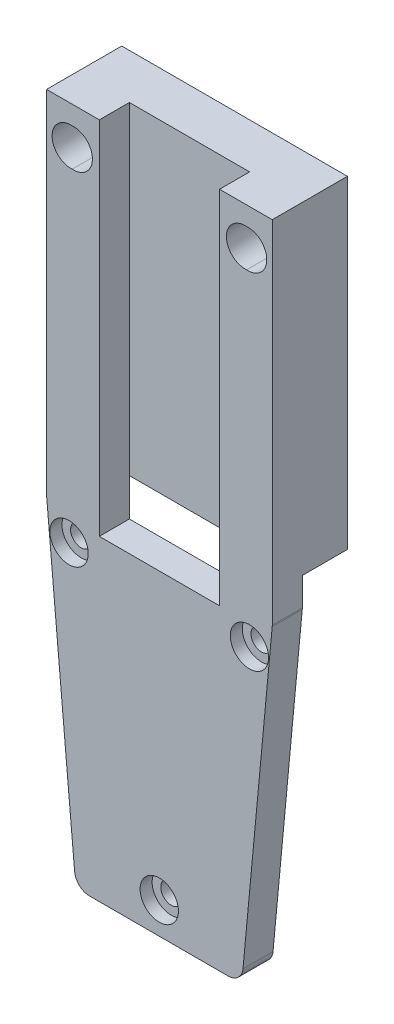
ISO-10303-21;
HEADER;
FILE_DESCRIPTION(('STEP AP214'),'2;1');
FILE_NAME('part.step','',(''),(''),'','','');
FILE_SCHEMA(('AUTOMOTIVE_DESIGN { 1 0 10303 214 1 1 1 1 }'));
ENDSEC;
DATA;
#1=APPLICATION_CONTEXT('core data for automotive mechanical design processes');
#2=APPLICATION_PROTOCOL_DEFINITION('international standard','automotive_design',2000,#1);
#3=PRODUCT_CONTEXT('',#1,'mechanical');
#4=PRODUCT('Part','Part','',(#3));
#5=PRODUCT_RELATED_PRODUCT_CATEGORY('part','',(#4));
#6=PRODUCT_DEFINITION_FORMATION('','',#4);
#7=PRODUCT_DEFINITION_CONTEXT('part definition',#1,'design');
#8=PRODUCT_DEFINITION('design','',#6,#7);
#9=PRODUCT_DEFINITION_SHAPE('','',#8);
#10=(LENGTH_UNIT() NAMED_UNIT(*) SI_UNIT(.MILLI.,.METRE.));
#11=(NAMED_UNIT(*) PLANE_ANGLE_UNIT() SI_UNIT($,.RADIAN.));
#12=(NAMED_UNIT(*) SI_UNIT($,.STERADIAN.) SOLID_ANGLE_UNIT());
#13=UNCERTAINTY_MEASURE_WITH_UNIT(LENGTH_MEASURE(1.E-05),#10,'distance_accuracy_value','');
#14=(GEOMETRIC_REPRESENTATION_CONTEXT(3) GLOBAL_UNCERTAINTY_ASSIGNED_CONTEXT((#13)) GLOBAL_UNIT_ASSIGNED_CONTEXT((#10,
#11,#12)) REPRESENTATION_CONTEXT('',''));
#15=CARTESIAN_POINT('',(0.,0.,0.));
#16=DIRECTION('',(0.,0.,1.));
#17=DIRECTION('',(1.,0.,0.));
#18=AXIS2_PLACEMENT_3D('',#15,#16,#17);
#19=CARTESIAN_POINT('',(0.,0.,2.));
#20=DIRECTION('',(0.,0.,-1.));
#21=DIRECTION('',(-1.,0.,0.));
#22=AXIS2_PLACEMENT_3D('',#19,#20,#21);
#23=CYLINDRICAL_SURFACE('',#22,0.700000000000001);
#24=CARTESIAN_POINT('',(0.,0.,0.));
#25=DIRECTION('',(0.,0.,1.));
#26=DIRECTION('',(1.,0.,0.));
#27=AXIS2_PLACEMENT_3D('',#24,#25,#26);
#28=CIRCLE('',#27,0.700000000000001);
#29=CARTESIAN_POINT('',(0.700000000000001,0.,0.));
#30=VERTEX_POINT('',#29);
#31=EDGE_CURVE('E338',#30,#30,#28,.T.);
#32=ORIENTED_EDGE('',*,*,#31,.F.);
#33=EDGE_LOOP('',(#32));
#34=FACE_BOUND('',#33,.T.);
#35=CARTESIAN_POINT('',(0.,0.,1.2));
#36=DIRECTION('',(0.,0.,1.));
#37=DIRECTION('',(1.,0.,0.));
#38=AXIS2_PLACEMENT_3D('',#35,#36,#37);
#39=CIRCLE('',#38,0.700000000000001);
#40=CARTESIAN_POINT('',(0.700000000000001,0.,1.2));
#41=VERTEX_POINT('',#40);
#42=EDGE_CURVE('E253',#41,#41,#39,.T.);
#43=ORIENTED_EDGE('',*,*,#42,.T.);
#44=EDGE_LOOP('',(#43));
#45=FACE_BOUND('',#44,.T.);
#46=ADVANCED_FACE('F49',(#34,#45),#23,.F.);
#47=CARTESIAN_POINT('',(6.0000000164,17.5961946972,2.));
#48=DIRECTION('',(0.,0.,-1.));
#49=DIRECTION('',(-1.,0.,0.));
#50=AXIS2_PLACEMENT_3D('',#47,#48,#49);
#51=CYLINDRICAL_SURFACE('',#50,0.699999999999999);
#52=CARTESIAN_POINT('',(6.0000000164,17.5961946972,0.));
#53=DIRECTION('',(0.,0.,1.));
#54=DIRECTION('',(1.,0.,0.));
#55=AXIS2_PLACEMENT_3D('',#52,#53,#54);
#56=CIRCLE('',#55,0.699999999999999);
#57=CARTESIAN_POINT('',(6.7000000164,17.5961946972,0.));
#58=VERTEX_POINT('',#57);
#59=EDGE_CURVE('E335',#58,#58,#56,.T.);
#60=ORIENTED_EDGE('',*,*,#59,.F.);
#61=EDGE_LOOP('',(#60));
#62=FACE_BOUND('',#61,.T.);
#63=CARTESIAN_POINT('',(6.0000000164,17.5961946972,1.2));
#64=DIRECTION('',(0.,0.,1.));
#65=DIRECTION('',(1.,0.,0.));
#66=AXIS2_PLACEMENT_3D('',#63,#64,#65);
#67=CIRCLE('',#66,0.699999999999999);
#68=CARTESIAN_POINT('',(6.7000000164,17.5961946972,1.2));
#69=VERTEX_POINT('',#68);
#70=EDGE_CURVE('E389',#69,#69,#67,.T.);
#71=ORIENTED_EDGE('',*,*,#70,.T.);
#72=EDGE_LOOP('',(#71));
#73=FACE_BOUND('',#72,.T.);
#74=ADVANCED_FACE('F480',(#62,#73),#51,.F.);
#75=CARTESIAN_POINT('',(-5.9999999917,17.5961946995,2.));
#76=DIRECTION('',(0.,0.,-1.));
#77=DIRECTION('',(-1.,0.,0.));
#78=AXIS2_PLACEMENT_3D('',#75,#76,#77);
#79=CYLINDRICAL_SURFACE('',#78,0.7);
#80=CARTESIAN_POINT('',(-5.9999999917,17.5961946995,0.));
#81=DIRECTION('',(0.,0.,1.));
#82=DIRECTION('',(1.,0.,0.));
#83=AXIS2_PLACEMENT_3D('',#80,#81,#82);
#84=CIRCLE('',#83,0.7);
#85=CARTESIAN_POINT('',(-5.2999999917,17.5961946995,0.));
#86=VERTEX_POINT('',#85);
#87=EDGE_CURVE('E326',#86,#86,#84,.T.);
#88=ORIENTED_EDGE('',*,*,#87,.F.);
#89=EDGE_LOOP('',(#88));
#90=FACE_BOUND('',#89,.T.);
#91=CARTESIAN_POINT('',(-5.9999999917,17.5961946995,1.2));
#92=DIRECTION('',(0.,0.,1.));
#93=DIRECTION('',(1.,0.,0.));
#94=AXIS2_PLACEMENT_3D('',#91,#92,#93);
#95=CIRCLE('',#94,0.7);
#96=CARTESIAN_POINT('',(-5.2999999917,17.5961946995,1.2));
#97=VERTEX_POINT('',#96);
#98=EDGE_CURVE('E237',#97,#97,#95,.T.);
#99=ORIENTED_EDGE('',*,*,#98,.T.);
#100=EDGE_LOOP('',(#99));
#101=FACE_BOUND('',#100,.T.);
#102=ADVANCED_FACE('F487',(#90,#101),#79,.F.);
#103=CARTESIAN_POINT('',(6.51847131240383,19.6020664223838,2.));
#104=DIRECTION('',(0.,0.,-1.));
#105=DIRECTION('',(-1.,0.,0.));
#106=AXIS2_PLACEMENT_3D('',#103,#104,#105);
#107=CYLINDRICAL_SURFACE('',#106,1.00000000001619);
#108=DIRECTION('',(0.,0.,-1.));
#109=VECTOR('',#108,1.);
#110=CARTESIAN_POINT('',(7.51847131242001,19.6020664224,0.));
#111=LINE('',#110,#109);
#112=CARTESIAN_POINT('',(7.51847131242001,19.6020664224,2.));
#113=VERTEX_POINT('',#112);
#114=CARTESIAN_POINT('',(7.51847131242001,19.6020664224,0.));
#115=VERTEX_POINT('',#114);
#116=EDGE_CURVE('E319',#113,#115,#111,.T.);
#117=ORIENTED_EDGE('',*,*,#116,.F.);
#118=CARTESIAN_POINT('',(6.51847131240383,19.6020664223838,2.));
#119=DIRECTION('',(0.,0.,1.));
#120=DIRECTION('',(1.,0.,0.));
#121=AXIS2_PLACEMENT_3D('',#118,#119,#120);
#122=CIRCLE('',#121,1.00000000001619);
#123=CARTESIAN_POINT('',(7.51408358778784,19.5084918684867,2.));
#124=VERTEX_POINT('',#123);
#125=EDGE_CURVE('E342',#124,#113,#122,.T.);
#126=ORIENTED_EDGE('',*,*,#125,.F.);
#127=DIRECTION('',(0.,0.,-1.));
#128=VECTOR('',#127,1.);
#129=CARTESIAN_POINT('',(7.51408358778784,19.5084918684867,2.));
#130=LINE('',#129,#128);
#131=CARTESIAN_POINT('',(7.51408358778784,19.5084918684867,0.));
#132=VERTEX_POINT('',#131);
#133=EDGE_CURVE('E358',#124,#132,#130,.T.);
#134=ORIENTED_EDGE('',*,*,#133,.T.);
#135=CARTESIAN_POINT('',(6.51847131240383,19.6020664223838,0.));
#136=DIRECTION('',(0.,0.,1.));
#137=DIRECTION('',(1.,0.,0.));
#138=AXIS2_PLACEMENT_3D('',#135,#136,#137);
#139=CIRCLE('',#138,1.00000000001619);
#140=EDGE_CURVE('E341',#132,#115,#139,.T.);
#141=ORIENTED_EDGE('',*,*,#140,.T.);
#142=EDGE_LOOP('',(#117,#126,#134,#141));
#143=FACE_BOUND('',#142,.T.);
#144=ADVANCED_FACE('F51',(#143),#107,.T.);
#145=CARTESIAN_POINT('',(-6.4963963842,19.6020664224,2.));
#146=DIRECTION('',(0.,0.,-1.));
#147=DIRECTION('',(-1.,0.,0.));
#148=AXIS2_PLACEMENT_3D('',#145,#146,#147);
#149=CYLINDRICAL_SURFACE('',#148,0.999999999999999);
#150=DIRECTION('',(0.,0.,1.));
#151=VECTOR('',#150,1.);
#152=CARTESIAN_POINT('',(-7.4963963842,19.6020664224,0.));
#153=LINE('',#152,#151);
#154=CARTESIAN_POINT('',(-7.4963963842,19.6020664224,0.));
#155=VERTEX_POINT('',#154);
#156=CARTESIAN_POINT('',(-7.4963963842,19.6020664224,2.));
#157=VERTEX_POINT('',#156);
#158=EDGE_CURVE('E316',#155,#157,#153,.T.);
#159=ORIENTED_EDGE('',*,*,#158,.F.);
#160=CARTESIAN_POINT('',(-6.4963963842,19.6020664224,0.));
#161=DIRECTION('',(0.,0.,1.));
#162=DIRECTION('',(1.,0.,0.));
#163=AXIS2_PLACEMENT_3D('',#160,#161,#162);
#164=CIRCLE('',#163,0.999999999999999);
#165=CARTESIAN_POINT('',(-7.4923720904787,19.5124428066359,0.));
#166=VERTEX_POINT('',#165);
#167=EDGE_CURVE('E360',#155,#166,#164,.T.);
#168=ORIENTED_EDGE('',*,*,#167,.T.);
#169=DIRECTION('',(0.,0.,-1.));
#170=VECTOR('',#169,1.);
#171=CARTESIAN_POINT('',(-7.4923720904787,19.5124428066359,2.));
#172=LINE('',#171,#170);
#173=CARTESIAN_POINT('',(-7.4923720904787,19.5124428066359,2.));
#174=VERTEX_POINT('',#173);
#175=EDGE_CURVE('E199',#174,#166,#172,.T.);
#176=ORIENTED_EDGE('',*,*,#175,.F.);
#177=CARTESIAN_POINT('',(-6.4963963842,19.6020664224,2.));
#178=DIRECTION('',(0.,0.,1.));
#179=DIRECTION('',(1.,0.,0.));
#180=AXIS2_PLACEMENT_3D('',#177,#178,#179);
#181=CIRCLE('',#180,0.999999999999999);
#182=EDGE_CURVE('E345',#157,#174,#181,.T.);
#183=ORIENTED_EDGE('',*,*,#182,.F.);
#184=EDGE_LOOP('',(#159,#168,#176,#183));
#185=FACE_BOUND('',#184,.T.);
#186=ADVANCED_FACE('F411',(#185),#149,.T.);
#187=CARTESIAN_POINT('',(6.51847131240383,19.6020664223838,2.));
#188=DIRECTION('',(0.,0.,1.));
#189=DIRECTION('',(1.,0.,0.));
#190=AXIS2_PLACEMENT_3D('',#187,#188,#189);
#191=PLANE('',#190);
#192=CARTESIAN_POINT('',(-5.69639638419982,40.4680094846855,2.));
#193=DIRECTION('',(0.,0.,1.));
#194=DIRECTION('',(1.,0.,0.));
#195=AXIS2_PLACEMENT_3D('',#192,#193,#194);
#196=CIRCLE('',#195,1.24999999999906);
#197=CARTESIAN_POINT('',(-5.78896253588998,39.22144159341,2.));
#198=VERTEX_POINT('',#197);
#199=CARTESIAN_POINT('',(-5.78896253588998,41.7145773759609,2.));
#200=VERTEX_POINT('',#199);
#201=EDGE_CURVE('E64',#198,#200,#196,.T.);
#202=ORIENTED_EDGE('',*,*,#201,.F.);
#203=CARTESIAN_POINT('',(-5.88152868758014,40.4680094846855,2.));
#204=DIRECTION('',(0.,0.,-1.));
#205=DIRECTION('',(-1.,0.,0.));
#206=AXIS2_PLACEMENT_3D('',#203,#204,#205);
#207=CIRCLE('',#206,1.24999999999906);
#208=EDGE_CURVE('E224',#198,#200,#207,.T.);
#209=ORIENTED_EDGE('',*,*,#208,.T.);
#210=EDGE_LOOP('',(#202,#209));
#211=FACE_BOUND('',#210,.T.);
#212=CARTESIAN_POINT('',(5.90360361580018,40.4680094846855,2.));
#213=DIRECTION('',(0.,0.,1.));
#214=DIRECTION('',(1.,0.,0.));
#215=AXIS2_PLACEMENT_3D('',#212,#213,#214);
#216=CIRCLE('',#215,1.24999999999906);
#217=CARTESIAN_POINT('',(5.81103746411002,39.22144159341,2.));
#218=VERTEX_POINT('',#217);
#219=CARTESIAN_POINT('',(5.81103746411002,41.7145773759609,2.));
#220=VERTEX_POINT('',#219);
#221=EDGE_CURVE('E72',#218,#220,#216,.T.);
#222=ORIENTED_EDGE('',*,*,#221,.F.);
#223=CARTESIAN_POINT('',(5.71847131241986,40.4680094846855,2.));
#224=DIRECTION('',(0.,0.,-1.));
#225=DIRECTION('',(-1.,0.,0.));
#226=AXIS2_PLACEMENT_3D('',#223,#224,#225);
#227=CIRCLE('',#226,1.24999999999906);
#228=EDGE_CURVE('E216',#218,#220,#227,.T.);
#229=ORIENTED_EDGE('',*,*,#228,.T.);
#230=EDGE_LOOP('',(#222,#229));
#231=FACE_BOUND('',#230,.T.);
#232=CARTESIAN_POINT('',(-5.9999999917,17.5961946995,2.));
#233=DIRECTION('',(0.,0.,1.));
#234=DIRECTION('',(1.,0.,0.));
#235=AXIS2_PLACEMENT_3D('',#232,#233,#234);
#236=CIRCLE('',#235,1.275);
#237=CARTESIAN_POINT('',(-4.7249999917,17.5961946995,2.));
#238=VERTEX_POINT('',#237);
#239=EDGE_CURVE('E238',#238,#238,#236,.T.);
#240=ORIENTED_EDGE('',*,*,#239,.F.);
#241=EDGE_LOOP('',(#240));
#242=FACE_BOUND('',#241,.T.);
#243=CARTESIAN_POINT('',(6.0000000164,17.5961946972,2.));
#244=DIRECTION('',(0.,0.,1.));
#245=DIRECTION('',(1.,0.,0.));
#246=AXIS2_PLACEMENT_3D('',#243,#244,#245);
#247=CIRCLE('',#246,1.275);
#248=CARTESIAN_POINT('',(7.2750000164,17.5961946972,2.));
#249=VERTEX_POINT('',#248);
#250=EDGE_CURVE('E241',#249,#249,#247,.T.);
#251=ORIENTED_EDGE('',*,*,#250,.F.);
#252=EDGE_LOOP('',(#251));
#253=FACE_BOUND('',#252,.T.);
#254=CARTESIAN_POINT('',(0.,0.,2.));
#255=DIRECTION('',(0.,0.,1.));
#256=DIRECTION('',(1.,0.,0.));
#257=AXIS2_PLACEMENT_3D('',#254,#255,#256);
#258=CIRCLE('',#257,1.275);
#259=CARTESIAN_POINT('',(1.275,0.,2.));
#260=VERTEX_POINT('',#259);
#261=EDGE_CURVE('E213',#260,#260,#258,.T.);
#262=ORIENTED_EDGE('',*,*,#261,.F.);
#263=EDGE_LOOP('',(#262));
#264=FACE_BOUND('',#263,.T.);
#265=DIRECTION('',(0.,1.,0.));
#266=VECTOR('',#265,1.);
#267=CARTESIAN_POINT('',(7.51847131242001,19.6020664224,2.));
#268=LINE('',#267,#266);
#269=CARTESIAN_POINT('',(7.51847131242001,42.9620664224,2.));
#270=VERTEX_POINT('',#269);
#271=EDGE_CURVE('E330',#113,#270,#268,.T.);
#272=ORIENTED_EDGE('',*,*,#271,.T.);
#273=DIRECTION('',(1.,0.,0.));
#274=VECTOR('',#273,1.);
#275=CARTESIAN_POINT('',(0.,42.9620664224,2.));
#276=LINE('',#275,#274);
#277=CARTESIAN_POINT('',(4.01103746411,42.9620664224,2.));
#278=VERTEX_POINT('',#277);
#279=EDGE_CURVE('E256',#278,#270,#276,.T.);
#280=ORIENTED_EDGE('',*,*,#279,.F.);
#281=DIRECTION('',(0.,-1.,0.));
#282=VECTOR('',#281,1.);
#283=CARTESIAN_POINT('',(4.01103746411001,23.9620664224,2.));
#284=LINE('',#283,#282);
#285=CARTESIAN_POINT('',(4.01103746411001,18.9620664224,2.));
#286=VERTEX_POINT('',#285);
#287=EDGE_CURVE('E296',#278,#286,#284,.T.);
#288=ORIENTED_EDGE('',*,*,#287,.T.);
#289=DIRECTION('',(-1.,0.,0.));
#290=VECTOR('',#289,1.);
#291=CARTESIAN_POINT('',(4.01103746411001,18.9620664224,2.));
#292=LINE('',#291,#290);
#293=CARTESIAN_POINT('',(-3.98896253588999,18.9620664224,2.));
#294=VERTEX_POINT('',#293);
#295=EDGE_CURVE('E299',#286,#294,#292,.T.);
#296=ORIENTED_EDGE('',*,*,#295,.T.);
#297=DIRECTION('',(0.,1.,0.));
#298=VECTOR('',#297,1.);
#299=CARTESIAN_POINT('',(-3.98896253588999,23.9620664224,2.));
#300=LINE('',#299,#298);
#301=CARTESIAN_POINT('',(-3.98896253588999,42.9620664224,2.));
#302=VERTEX_POINT('',#301);
#303=EDGE_CURVE('E294',#294,#302,#300,.T.);
#304=ORIENTED_EDGE('',*,*,#303,.T.);
#305=DIRECTION('',(1.,0.,0.));
#306=VECTOR('',#305,1.);
#307=CARTESIAN_POINT('',(0.,42.9620664224,2.));
#308=LINE('',#307,#306);
#309=CARTESIAN_POINT('',(-7.4963963842,42.9620664224,2.));
#310=VERTEX_POINT('',#309);
#311=EDGE_CURVE('E268',#310,#302,#308,.T.);
#312=ORIENTED_EDGE('',*,*,#311,.F.);
#313=DIRECTION('',(0.,1.,0.));
#314=VECTOR('',#313,1.);
#315=CARTESIAN_POINT('',(-7.4963963842,19.6020664224,2.));
#316=LINE('',#315,#314);
#317=EDGE_CURVE('E322',#157,#310,#316,.T.);
#318=ORIENTED_EDGE('',*,*,#317,.F.);
#319=ORIENTED_EDGE('',*,*,#182,.T.);
#320=DIRECTION('',(0.0896236157641481,-0.995975706278702,0.));
#321=VECTOR('',#320,1.);
#322=CARTESIAN_POINT('',(-7.49237209047871,19.5124428066359,2.));
#323=LINE('',#322,#321);
#324=CARTESIAN_POINT('',(-5.6307454508,-1.1755744249,2.));
#325=VERTEX_POINT('',#324);
#326=EDGE_CURVE('E348',#174,#325,#323,.T.);
#327=ORIENTED_EDGE('',*,*,#326,.T.);
#328=CARTESIAN_POINT('',(-4.63476974451216,-1.08595080910109,2.));
#329=DIRECTION('',(0.,0.,1.));
#330=DIRECTION('',(1.,0.,0.));
#331=AXIS2_PLACEMENT_3D('',#328,#329,#330);
#332=CIRCLE('',#331,1.00000000001221);
#333=CARTESIAN_POINT('',(-4.63476974452962,-2.0859508091133,2.));
#334=VERTEX_POINT('',#333);
#335=EDGE_CURVE('E350',#325,#334,#332,.T.);
#336=ORIENTED_EDGE('',*,*,#335,.T.);
#337=DIRECTION('',(1.,0.,0.));
#338=VECTOR('',#337,1.);
#339=CARTESIAN_POINT('',(-4.63476974452962,-2.08595080911331,2.));
#340=LINE('',#339,#338);
#341=CARTESIAN_POINT('',(4.57406782178784,-2.08595080911331,2.));
#342=VERTEX_POINT('',#341);
#343=EDGE_CURVE('E352',#334,#342,#340,.T.);
#344=ORIENTED_EDGE('',*,*,#343,.T.);
#345=CARTESIAN_POINT('',(4.57406782178784,-1.08595080911331,2.));
#346=DIRECTION('',(0.,0.,1.));
#347=DIRECTION('',(1.,0.,0.));
#348=AXIS2_PLACEMENT_3D('',#345,#346,#347);
#349=CIRCLE('',#348,1.);
#350=CARTESIAN_POINT('',(5.5696800971553,-1.17952536301354,2.));
#351=VERTEX_POINT('',#350);
#352=EDGE_CURVE('E354',#342,#351,#349,.T.);
#353=ORIENTED_EDGE('',*,*,#352,.T.);
#354=DIRECTION('',(0.0935745539013411,0.995612275367356,0.));
#355=VECTOR('',#354,1.);
#356=CARTESIAN_POINT('',(5.5696800971553,-1.17952536301354,2.));
#357=LINE('',#356,#355);
#358=EDGE_CURVE('E356',#351,#124,#357,.T.);
#359=ORIENTED_EDGE('',*,*,#358,.T.);
#360=ORIENTED_EDGE('',*,*,#125,.T.);
#361=EDGE_LOOP('',(#272,#280,#288,#296,#304,#312,#318,#319,#327,#336,#344,#353,#359,#360));
#362=FACE_BOUND('',#361,.T.);
#363=ADVANCED_FACE('F228',(#211,#231,#242,#253,#264,#362),#191,.T.);
#364=CARTESIAN_POINT('',(6.51847131240383,19.6020664223838,0.));
#365=DIRECTION('',(0.,0.,1.));
#366=DIRECTION('',(1.,0.,0.));
#367=AXIS2_PLACEMENT_3D('',#364,#365,#366);
#368=PLANE('',#367);
#369=DIRECTION('',(-1.,0.,0.));
#370=VECTOR('',#369,1.);
#371=CARTESIAN_POINT('',(-7.4963963842,21.4620664224,0.));
#372=LINE('',#371,#370);
#373=CARTESIAN_POINT('',(-3.98896253588999,21.4620664224,0.));
#374=VERTEX_POINT('',#373);
#375=CARTESIAN_POINT('',(-7.4963963842,21.4620664224,0.));
#376=VERTEX_POINT('',#375);
#377=EDGE_CURVE('E310',#374,#376,#372,.T.);
#378=ORIENTED_EDGE('',*,*,#377,.F.);
#379=DIRECTION('',(0.,1.,0.));
#380=VECTOR('',#379,1.);
#381=CARTESIAN_POINT('',(-3.98896253588999,23.9620664224,0.));
#382=LINE('',#381,#380);
#383=CARTESIAN_POINT('',(-3.98896253588999,18.9620664224,0.));
#384=VERTEX_POINT('',#383);
#385=EDGE_CURVE('E291',#384,#374,#382,.T.);
#386=ORIENTED_EDGE('',*,*,#385,.F.);
#387=DIRECTION('',(-1.,0.,0.));
#388=VECTOR('',#387,1.);
#389=CARTESIAN_POINT('',(4.01103746411001,18.9620664224,0.));
#390=LINE('',#389,#388);
#391=CARTESIAN_POINT('',(4.01103746411001,18.9620664224,0.));
#392=VERTEX_POINT('',#391);
#393=EDGE_CURVE('E297',#392,#384,#390,.T.);
#394=ORIENTED_EDGE('',*,*,#393,.F.);
#395=DIRECTION('',(0.,-1.,0.));
#396=VECTOR('',#395,1.);
#397=CARTESIAN_POINT('',(4.01103746411001,23.9620664224,0.));
#398=LINE('',#397,#396);
#399=CARTESIAN_POINT('',(4.01103746411001,21.4620664224,0.));
#400=VERTEX_POINT('',#399);
#401=EDGE_CURVE('E304',#400,#392,#398,.T.);
#402=ORIENTED_EDGE('',*,*,#401,.F.);
#403=CARTESIAN_POINT('',(7.51847131242001,21.4620664224,0.));
#404=VERTEX_POINT('',#403);
#405=EDGE_CURVE('E313',#404,#400,#372,.T.);
#406=ORIENTED_EDGE('',*,*,#405,.F.);
#407=DIRECTION('',(0.,1.,0.));
#408=VECTOR('',#407,1.);
#409=CARTESIAN_POINT('',(7.51847131242001,19.6020664224,0.));
#410=LINE('',#409,#408);
#411=EDGE_CURVE('E327',#115,#404,#410,.T.);
#412=ORIENTED_EDGE('',*,*,#411,.F.);
#413=ORIENTED_EDGE('',*,*,#140,.F.);
#414=DIRECTION('',(0.0935745539013411,0.995612275367356,0.));
#415=VECTOR('',#414,1.);
#416=CARTESIAN_POINT('',(5.5696800971553,-1.17952536301354,0.));
#417=LINE('',#416,#415);
#418=CARTESIAN_POINT('',(5.5696800971553,-1.17952536301354,0.));
#419=VERTEX_POINT('',#418);
#420=EDGE_CURVE('E346',#419,#132,#417,.T.);
#421=ORIENTED_EDGE('',*,*,#420,.F.);
#422=CARTESIAN_POINT('',(4.57406782178784,-1.08595080911331,0.));
#423=DIRECTION('',(0.,0.,1.));
#424=DIRECTION('',(1.,0.,0.));
#425=AXIS2_PLACEMENT_3D('',#422,#423,#424);
#426=CIRCLE('',#425,1.);
#427=CARTESIAN_POINT('',(4.57406782178784,-2.08595080911331,0.));
#428=VERTEX_POINT('',#427);
#429=EDGE_CURVE('E368',#428,#419,#426,.T.);
#430=ORIENTED_EDGE('',*,*,#429,.F.);
#431=DIRECTION('',(1.,0.,0.));
#432=VECTOR('',#431,1.);
#433=CARTESIAN_POINT('',(-4.63476974452962,-2.08595080911331,0.));
#434=LINE('',#433,#432);
#435=CARTESIAN_POINT('',(-4.63476974452962,-2.0859508091133,0.));
#436=VERTEX_POINT('',#435);
#437=EDGE_CURVE('E366',#436,#428,#434,.T.);
#438=ORIENTED_EDGE('',*,*,#437,.F.);
#439=CARTESIAN_POINT('',(-4.63476974451216,-1.08595080910109,0.));
#440=DIRECTION('',(0.,0.,1.));
#441=DIRECTION('',(1.,0.,0.));
#442=AXIS2_PLACEMENT_3D('',#439,#440,#441);
#443=CIRCLE('',#442,1.00000000001221);
#444=CARTESIAN_POINT('',(-5.6307454508,-1.1755744249,0.));
#445=VERTEX_POINT('',#444);
#446=EDGE_CURVE('E364',#445,#436,#443,.T.);
#447=ORIENTED_EDGE('',*,*,#446,.F.);
#448=DIRECTION('',(0.0896236157641481,-0.995975706278702,0.));
#449=VECTOR('',#448,1.);
#450=CARTESIAN_POINT('',(-7.49237209047871,19.5124428066359,0.));
#451=LINE('',#450,#449);
#452=EDGE_CURVE('E362',#166,#445,#451,.T.);
#453=ORIENTED_EDGE('',*,*,#452,.F.);
#454=ORIENTED_EDGE('',*,*,#167,.F.);
#455=DIRECTION('',(0.,1.,0.));
#456=VECTOR('',#455,1.);
#457=CARTESIAN_POINT('',(-7.4963963842,19.6020664224,0.));
#458=LINE('',#457,#456);
#459=EDGE_CURVE('E323',#155,#376,#458,.T.);
#460=ORIENTED_EDGE('',*,*,#459,.T.);
#461=EDGE_LOOP('',(#378,#386,#394,#402,#406,#412,#413,#421,#430,#438,#447,#453,#454,#460));
#462=FACE_BOUND('',#461,.T.);
#463=ORIENTED_EDGE('',*,*,#87,.T.);
#464=EDGE_LOOP('',(#463));
#465=FACE_BOUND('',#464,.T.);
#466=ORIENTED_EDGE('',*,*,#59,.T.);
#467=EDGE_LOOP('',(#466));
#468=FACE_BOUND('',#467,.T.);
#469=ORIENTED_EDGE('',*,*,#31,.T.);
#470=EDGE_LOOP('',(#469));
#471=FACE_BOUND('',#470,.T.);
#472=ADVANCED_FACE('F410',(#462,#465,#468,#471),#368,.F.);
#473=CARTESIAN_POINT('',(-7.49237209047871,19.5124428066359,2.));
#474=DIRECTION('',(0.995975706278702,0.0896236157641481,0.));
#475=DIRECTION('',(-0.0896236157641481,0.995975706278703,0.));
#476=AXIS2_PLACEMENT_3D('',#473,#474,#475);
#477=PLANE('',#476);
#478=ORIENTED_EDGE('',*,*,#452,.T.);
#479=DIRECTION('',(0.,0.,-1.));
#480=VECTOR('',#479,1.);
#481=CARTESIAN_POINT('',(-5.6307454508,-1.1755744249,2.));
#482=LINE('',#481,#480);
#483=EDGE_CURVE('E382',#325,#445,#482,.T.);
#484=ORIENTED_EDGE('',*,*,#483,.F.);
#485=ORIENTED_EDGE('',*,*,#326,.F.);
#486=ORIENTED_EDGE('',*,*,#175,.T.);
#487=EDGE_LOOP('',(#478,#484,#485,#486));
#488=FACE_BOUND('',#487,.T.);
#489=ADVANCED_FACE('F443',(#488),#477,.F.);
#490=CARTESIAN_POINT('',(-4.63476974451216,-1.08595080910109,2.));
#491=DIRECTION('',(0.,0.,-1.));
#492=DIRECTION('',(-1.,0.,0.));
#493=AXIS2_PLACEMENT_3D('',#490,#491,#492);
#494=CYLINDRICAL_SURFACE('',#493,1.00000000001221);
#495=ORIENTED_EDGE('',*,*,#446,.T.);
#496=DIRECTION('',(0.,0.,-1.));
#497=VECTOR('',#496,1.);
#498=CARTESIAN_POINT('',(-4.63476974452962,-2.0859508091133,2.));
#499=LINE('',#498,#497);
#500=EDGE_CURVE('E379',#334,#436,#499,.T.);
#501=ORIENTED_EDGE('',*,*,#500,.F.);
#502=ORIENTED_EDGE('',*,*,#335,.F.);
#503=ORIENTED_EDGE('',*,*,#483,.T.);
#504=EDGE_LOOP('',(#495,#501,#502,#503));
#505=FACE_BOUND('',#504,.T.);
#506=ADVANCED_FACE('F505',(#505),#494,.T.);
#507=CARTESIAN_POINT('',(-4.63476974452962,-2.08595080911331,2.));
#508=DIRECTION('',(0.,1.,0.));
#509=DIRECTION('',(0.,0.,1.));
#510=AXIS2_PLACEMENT_3D('',#507,#508,#509);
#511=PLANE('',#510);
#512=ORIENTED_EDGE('',*,*,#437,.T.);
#513=DIRECTION('',(0.,0.,-1.));
#514=VECTOR('',#513,1.);
#515=CARTESIAN_POINT('',(4.57406782178784,-2.08595080911331,2.));
#516=LINE('',#515,#514);
#517=EDGE_CURVE('E376',#342,#428,#516,.T.);
#518=ORIENTED_EDGE('',*,*,#517,.F.);
#519=ORIENTED_EDGE('',*,*,#343,.F.);
#520=ORIENTED_EDGE('',*,*,#500,.T.);
#521=EDGE_LOOP('',(#512,#518,#519,#520));
#522=FACE_BOUND('',#521,.T.);
#523=ADVANCED_FACE('F501',(#522),#511,.F.);
#524=CARTESIAN_POINT('',(4.57406782178784,-1.08595080911331,2.));
#525=DIRECTION('',(0.,0.,-1.));
#526=DIRECTION('',(-1.,0.,0.));
#527=AXIS2_PLACEMENT_3D('',#524,#525,#526);
#528=CYLINDRICAL_SURFACE('',#527,1.);
#529=ORIENTED_EDGE('',*,*,#429,.T.);
#530=DIRECTION('',(0.,0.,-1.));
#531=VECTOR('',#530,1.);
#532=CARTESIAN_POINT('',(5.5696800971553,-1.17952536301354,2.));
#533=LINE('',#532,#531);
#534=EDGE_CURVE('E373',#351,#419,#533,.T.);
#535=ORIENTED_EDGE('',*,*,#534,.F.);
#536=ORIENTED_EDGE('',*,*,#352,.F.);
#537=ORIENTED_EDGE('',*,*,#517,.T.);
#538=EDGE_LOOP('',(#529,#535,#536,#537));
#539=FACE_BOUND('',#538,.T.);
#540=ADVANCED_FACE('F497',(#539),#528,.T.);
#541=CARTESIAN_POINT('',(5.5696800971553,-1.17952536301354,2.));
#542=DIRECTION('',(-0.995612275367357,0.0935745539013411,0.));
#543=DIRECTION('',(-0.0935745539013411,-0.995612275367357,0.));
#544=AXIS2_PLACEMENT_3D('',#541,#542,#543);
#545=PLANE('',#544);
#546=ORIENTED_EDGE('',*,*,#420,.T.);
#547=ORIENTED_EDGE('',*,*,#133,.F.);
#548=ORIENTED_EDGE('',*,*,#358,.F.);
#549=ORIENTED_EDGE('',*,*,#534,.T.);
#550=EDGE_LOOP('',(#546,#547,#548,#549));
#551=FACE_BOUND('',#550,.T.);
#552=ADVANCED_FACE('F494',(#551),#545,.F.);
#553=CARTESIAN_POINT('',(-7.4963963842,19.6020664224,0.));
#554=DIRECTION('',(-1.,0.,0.));
#555=DIRECTION('',(0.,0.,1.));
#556=AXIS2_PLACEMENT_3D('',#553,#554,#555);
#557=PLANE('',#556);
#558=ORIENTED_EDGE('',*,*,#317,.T.);
#559=DIRECTION('',(0.,0.,1.));
#560=VECTOR('',#559,1.);
#561=CARTESIAN_POINT('',(-7.4963963842,42.9620664224,0.));
#562=LINE('',#561,#560);
#563=CARTESIAN_POINT('',(-7.4963963842,42.9620664224,-3.));
#564=VERTEX_POINT('',#563);
#565=EDGE_CURVE('E265',#564,#310,#562,.T.);
#566=ORIENTED_EDGE('',*,*,#565,.F.);
#567=DIRECTION('',(0.,-1.,0.));
#568=VECTOR('',#567,1.);
#569=CARTESIAN_POINT('',(-7.4963963842,21.4620664224,-3.));
#570=LINE('',#569,#568);
#571=CARTESIAN_POINT('',(-7.4963963842,21.4620664224,-3.));
#572=VERTEX_POINT('',#571);
#573=EDGE_CURVE('E280',#564,#572,#570,.T.);
#574=ORIENTED_EDGE('',*,*,#573,.T.);
#575=DIRECTION('',(0.,0.,1.));
#576=VECTOR('',#575,1.);
#577=CARTESIAN_POINT('',(-7.4963963842,21.4620664224,-3.));
#578=LINE('',#577,#576);
#579=EDGE_CURVE('E288',#572,#376,#578,.T.);
#580=ORIENTED_EDGE('',*,*,#579,.T.);
#581=ORIENTED_EDGE('',*,*,#459,.F.);
#582=ORIENTED_EDGE('',*,*,#158,.T.);
#583=EDGE_LOOP('',(#558,#566,#574,#580,#581,#582));
#584=FACE_BOUND('',#583,.T.);
#585=ADVANCED_FACE('F431',(#584),#557,.T.);
#586=CARTESIAN_POINT('',(7.51847131242001,19.6020664224,0.));
#587=DIRECTION('',(1.,0.,0.));
#588=DIRECTION('',(0.,0.,-1.));
#589=AXIS2_PLACEMENT_3D('',#586,#587,#588);
#590=PLANE('',#589);
#591=ORIENTED_EDGE('',*,*,#411,.T.);
#592=DIRECTION('',(0.,0.,1.));
#593=VECTOR('',#592,1.);
#594=CARTESIAN_POINT('',(7.51847131242001,21.4620664224,-3.));
#595=LINE('',#594,#593);
#596=CARTESIAN_POINT('',(7.51847131242001,21.4620664224,-3.));
#597=VERTEX_POINT('',#596);
#598=EDGE_CURVE('E289',#597,#404,#595,.T.);
#599=ORIENTED_EDGE('',*,*,#598,.F.);
#600=DIRECTION('',(0.,1.,0.));
#601=VECTOR('',#600,1.);
#602=CARTESIAN_POINT('',(7.51847131242001,21.4620664224,-3.));
#603=LINE('',#602,#601);
#604=CARTESIAN_POINT('',(7.51847131242001,42.9620664224,-3.));
#605=VERTEX_POINT('',#604);
#606=EDGE_CURVE('E286',#597,#605,#603,.T.);
#607=ORIENTED_EDGE('',*,*,#606,.T.);
#608=DIRECTION('',(0.,0.,-1.));
#609=VECTOR('',#608,1.);
#610=CARTESIAN_POINT('',(7.51847131242001,42.9620664224,0.));
#611=LINE('',#610,#609);
#612=EDGE_CURVE('E259',#270,#605,#611,.T.);
#613=ORIENTED_EDGE('',*,*,#612,.F.);
#614=ORIENTED_EDGE('',*,*,#271,.F.);
#615=ORIENTED_EDGE('',*,*,#116,.T.);
#616=EDGE_LOOP('',(#591,#599,#607,#613,#614,#615));
#617=FACE_BOUND('',#616,.T.);
#618=ADVANCED_FACE('F422',(#617),#590,.T.);
#619=CARTESIAN_POINT('',(-3.98896253588999,23.9620664224,2.));
#620=DIRECTION('',(-1.,0.,0.));
#621=DIRECTION('',(0.,0.,1.));
#622=AXIS2_PLACEMENT_3D('',#619,#620,#621);
#623=PLANE('',#622);
#624=DIRECTION('',(0.,1.,0.));
#625=VECTOR('',#624,1.);
#626=CARTESIAN_POINT('',(-3.98896253588999,19.9620664224,0.));
#627=LINE('',#626,#625);
#628=CARTESIAN_POINT('',(-3.98896253588999,42.9620664224,0.));
#629=VERTEX_POINT('',#628);
#630=EDGE_CURVE('E275',#374,#629,#627,.T.);
#631=ORIENTED_EDGE('',*,*,#630,.T.);
#632=DIRECTION('',(0.,0.,-1.));
#633=VECTOR('',#632,1.);
#634=CARTESIAN_POINT('',(-3.98896253588999,42.9620664224,0.));
#635=LINE('',#634,#633);
#636=EDGE_CURVE('E271',#302,#629,#635,.T.);
#637=ORIENTED_EDGE('',*,*,#636,.F.);
#638=ORIENTED_EDGE('',*,*,#303,.F.);
#639=DIRECTION('',(0.,0.,-1.));
#640=VECTOR('',#639,1.);
#641=CARTESIAN_POINT('',(-3.98896253588999,18.9620664224,2.));
#642=LINE('',#641,#640);
#643=EDGE_CURVE('E308',#294,#384,#642,.T.);
#644=ORIENTED_EDGE('',*,*,#643,.T.);
#645=ORIENTED_EDGE('',*,*,#385,.T.);
#646=EDGE_LOOP('',(#631,#637,#638,#644,#645));
#647=FACE_BOUND('',#646,.T.);
#648=ADVANCED_FACE('F453',(#647),#623,.F.);
#649=CARTESIAN_POINT('',(4.01103746411001,18.9620664224,2.));
#650=DIRECTION('',(0.,-1.,0.));
#651=DIRECTION('',(0.,0.,-1.));
#652=AXIS2_PLACEMENT_3D('',#649,#650,#651);
#653=PLANE('',#652);
#654=ORIENTED_EDGE('',*,*,#393,.T.);
#655=ORIENTED_EDGE('',*,*,#643,.F.);
#656=ORIENTED_EDGE('',*,*,#295,.F.);
#657=DIRECTION('',(0.,0.,-1.));
#658=VECTOR('',#657,1.);
#659=CARTESIAN_POINT('',(4.01103746411001,18.9620664224,2.));
#660=LINE('',#659,#658);
#661=EDGE_CURVE('E302',#286,#392,#660,.T.);
#662=ORIENTED_EDGE('',*,*,#661,.T.);
#663=EDGE_LOOP('',(#654,#655,#656,#662));
#664=FACE_BOUND('',#663,.T.);
#665=ADVANCED_FACE('F467',(#664),#653,.F.);
#666=CARTESIAN_POINT('',(4.01103746411001,23.9620664224,2.));
#667=DIRECTION('',(1.,0.,0.));
#668=DIRECTION('',(0.,1.,0.));
#669=AXIS2_PLACEMENT_3D('',#666,#667,#668);
#670=PLANE('',#669);
#671=ORIENTED_EDGE('',*,*,#401,.T.);
#672=ORIENTED_EDGE('',*,*,#661,.F.);
#673=ORIENTED_EDGE('',*,*,#287,.F.);
#674=DIRECTION('',(0.,0.,1.));
#675=VECTOR('',#674,1.);
#676=CARTESIAN_POINT('',(4.01103746411001,42.9620664224,0.));
#677=LINE('',#676,#675);
#678=CARTESIAN_POINT('',(4.01103746411001,42.9620664224,0.));
#679=VERTEX_POINT('',#678);
#680=EDGE_CURVE('E252',#679,#278,#677,.T.);
#681=ORIENTED_EDGE('',*,*,#680,.F.);
#682=DIRECTION('',(0.,1.,0.));
#683=VECTOR('',#682,1.);
#684=CARTESIAN_POINT('',(4.01103746411001,19.9620664224,0.));
#685=LINE('',#684,#683);
#686=EDGE_CURVE('E274',#400,#679,#685,.T.);
#687=ORIENTED_EDGE('',*,*,#686,.F.);
#688=EDGE_LOOP('',(#671,#672,#673,#681,#687));
#689=FACE_BOUND('',#688,.T.);
#690=ADVANCED_FACE('F464',(#689),#670,.F.);
#691=CARTESIAN_POINT('',(-7.4963963842,21.4620664224,-3.));
#692=DIRECTION('',(0.,-1.,0.));
#693=DIRECTION('',(0.,0.,-1.));
#694=AXIS2_PLACEMENT_3D('',#691,#692,#693);
#695=PLANE('',#694);
#696=DIRECTION('',(1.,0.,0.));
#697=VECTOR('',#696,1.);
#698=CARTESIAN_POINT('',(-7.4963963842,21.4620664224,0.));
#699=LINE('',#698,#697);
#700=EDGE_CURVE('E277',#374,#400,#699,.T.);
#701=ORIENTED_EDGE('',*,*,#700,.F.);
#702=ORIENTED_EDGE('',*,*,#377,.T.);
#703=ORIENTED_EDGE('',*,*,#579,.F.);
#704=DIRECTION('',(1.,0.,0.));
#705=VECTOR('',#704,1.);
#706=CARTESIAN_POINT('',(-7.4963963842,21.4620664224,-3.));
#707=LINE('',#706,#705);
#708=EDGE_CURVE('E283',#572,#597,#707,.T.);
#709=ORIENTED_EDGE('',*,*,#708,.T.);
#710=ORIENTED_EDGE('',*,*,#598,.T.);
#711=ORIENTED_EDGE('',*,*,#405,.T.);
#712=EDGE_LOOP('',(#701,#702,#703,#709,#710,#711));
#713=FACE_BOUND('',#712,.T.);
#714=ADVANCED_FACE('F427',(#713),#695,.T.);
#715=CARTESIAN_POINT('',(0.,0.,-3.));
#716=DIRECTION('',(0.,0.,-1.));
#717=DIRECTION('',(-1.,0.,0.));
#718=AXIS2_PLACEMENT_3D('',#715,#716,#717);
#719=PLANE('',#718);
#720=CARTESIAN_POINT('',(-5.69639638419982,40.4680094846855,-3.));
#721=DIRECTION('',(0.,0.,1.));
#722=DIRECTION('',(1.,0.,0.));
#723=AXIS2_PLACEMENT_3D('',#720,#721,#722);
#724=CIRCLE('',#723,1.24999999999906);
#725=CARTESIAN_POINT('',(-5.78896253588998,39.22144159341,-3.));
#726=VERTEX_POINT('',#725);
#727=CARTESIAN_POINT('',(-5.78896253588998,41.7145773759609,-3.));
#728=VERTEX_POINT('',#727);
#729=EDGE_CURVE('E206',#726,#728,#724,.T.);
#730=ORIENTED_EDGE('',*,*,#729,.T.);
#731=CARTESIAN_POINT('',(-5.88152868758014,40.4680094846855,-3.));
#732=DIRECTION('',(0.,0.,-1.));
#733=DIRECTION('',(-1.,0.,0.));
#734=AXIS2_PLACEMENT_3D('',#731,#732,#733);
#735=CIRCLE('',#734,1.24999999999906);
#736=EDGE_CURVE('E210',#726,#728,#735,.T.);
#737=ORIENTED_EDGE('',*,*,#736,.F.);
#738=EDGE_LOOP('',(#730,#737));
#739=FACE_BOUND('',#738,.T.);
#740=CARTESIAN_POINT('',(5.90360361580018,40.4680094846855,-3.));
#741=DIRECTION('',(0.,0.,1.));
#742=DIRECTION('',(1.,0.,0.));
#743=AXIS2_PLACEMENT_3D('',#740,#741,#742);
#744=CIRCLE('',#743,1.24999999999906);
#745=CARTESIAN_POINT('',(5.81103746411002,39.22144159341,-3.));
#746=VERTEX_POINT('',#745);
#747=CARTESIAN_POINT('',(5.81103746411002,41.7145773759609,-3.));
#748=VERTEX_POINT('',#747);
#749=EDGE_CURVE('E192',#746,#748,#744,.T.);
#750=ORIENTED_EDGE('',*,*,#749,.T.);
#751=CARTESIAN_POINT('',(5.71847131241986,40.4680094846855,-3.));
#752=DIRECTION('',(0.,0.,-1.));
#753=DIRECTION('',(-1.,0.,0.));
#754=AXIS2_PLACEMENT_3D('',#751,#752,#753);
#755=CIRCLE('',#754,1.24999999999906);
#756=EDGE_CURVE('E205',#746,#748,#755,.T.);
#757=ORIENTED_EDGE('',*,*,#756,.F.);
#758=EDGE_LOOP('',(#750,#757));
#759=FACE_BOUND('',#758,.T.);
#760=ORIENTED_EDGE('',*,*,#573,.F.);
#761=DIRECTION('',(-1.,0.,0.));
#762=VECTOR('',#761,1.);
#763=CARTESIAN_POINT('',(0.,42.9620664224,-3.));
#764=LINE('',#763,#762);
#765=EDGE_CURVE('E262',#605,#564,#764,.T.);
#766=ORIENTED_EDGE('',*,*,#765,.F.);
#767=ORIENTED_EDGE('',*,*,#606,.F.);
#768=ORIENTED_EDGE('',*,*,#708,.F.);
#769=EDGE_LOOP('',(#760,#766,#767,#768));
#770=FACE_BOUND('',#769,.T.);
#771=ADVANCED_FACE('F203',(#739,#759,#770),#719,.T.);
#772=CARTESIAN_POINT('',(-3.98896253588999,19.9620664224,0.));
#773=DIRECTION('',(0.,0.,-1.));
#774=DIRECTION('',(-1.,0.,0.));
#775=AXIS2_PLACEMENT_3D('',#772,#773,#774);
#776=PLANE('',#775);
#777=ORIENTED_EDGE('',*,*,#700,.T.);
#778=ORIENTED_EDGE('',*,*,#686,.T.);
#779=DIRECTION('',(1.,0.,0.));
#780=VECTOR('',#779,1.);
#781=CARTESIAN_POINT('',(0.,42.9620664224,0.));
#782=LINE('',#781,#780);
#783=EDGE_CURVE('E249',#629,#679,#782,.T.);
#784=ORIENTED_EDGE('',*,*,#783,.F.);
#785=ORIENTED_EDGE('',*,*,#630,.F.);
#786=EDGE_LOOP('',(#777,#778,#784,#785));
#787=FACE_BOUND('',#786,.T.);
#788=ADVANCED_FACE('F456',(#787),#776,.F.);
#789=CARTESIAN_POINT('',(0.,42.9620664224,0.));
#790=DIRECTION('',(0.,1.,0.));
#791=DIRECTION('',(0.,0.,1.));
#792=AXIS2_PLACEMENT_3D('',#789,#790,#791);
#793=PLANE('',#792);
#794=ORIENTED_EDGE('',*,*,#783,.T.);
#795=ORIENTED_EDGE('',*,*,#680,.T.);
#796=ORIENTED_EDGE('',*,*,#279,.T.);
#797=ORIENTED_EDGE('',*,*,#612,.T.);
#798=ORIENTED_EDGE('',*,*,#765,.T.);
#799=ORIENTED_EDGE('',*,*,#565,.T.);
#800=ORIENTED_EDGE('',*,*,#311,.T.);
#801=ORIENTED_EDGE('',*,*,#636,.T.);
#802=EDGE_LOOP('',(#794,#795,#796,#797,#798,#799,#800,#801));
#803=FACE_BOUND('',#802,.T.);
#804=ADVANCED_FACE('F419',(#803),#793,.T.);
#805=CARTESIAN_POINT('',(-5.9999999917,17.5961946995,1.2));
#806=DIRECTION('',(0.,0.,1.));
#807=DIRECTION('',(1.,0.,0.));
#808=AXIS2_PLACEMENT_3D('',#805,#806,#807);
#809=CYLINDRICAL_SURFACE('',#808,1.275);
#810=CARTESIAN_POINT('',(-5.9999999917,17.5961946995,1.2));
#811=DIRECTION('',(0.,0.,1.));
#812=DIRECTION('',(1.,0.,0.));
#813=AXIS2_PLACEMENT_3D('',#810,#811,#812);
#814=CIRCLE('',#813,1.275);
#815=CARTESIAN_POINT('',(-4.7249999917,17.5961946995,1.2));
#816=VERTEX_POINT('',#815);
#817=EDGE_CURVE('E234',#816,#816,#814,.T.);
#818=ORIENTED_EDGE('',*,*,#817,.F.);
#819=EDGE_LOOP('',(#818));
#820=FACE_BOUND('',#819,.T.);
#821=ORIENTED_EDGE('',*,*,#239,.T.);
#822=EDGE_LOOP('',(#821));
#823=FACE_BOUND('',#822,.T.);
#824=ADVANCED_FACE('F566',(#820,#823),#809,.F.);
#825=CARTESIAN_POINT('',(-5.9999999917,17.5961946995,1.2));
#826=DIRECTION('',(0.,0.,1.));
#827=DIRECTION('',(1.,0.,0.));
#828=AXIS2_PLACEMENT_3D('',#825,#826,#827);
#829=PLANE('',#828);
#830=ORIENTED_EDGE('',*,*,#98,.F.);
#831=EDGE_LOOP('',(#830));
#832=FACE_BOUND('',#831,.T.);
#833=ORIENTED_EDGE('',*,*,#817,.T.);
#834=EDGE_LOOP('',(#833));
#835=FACE_BOUND('',#834,.T.);
#836=ADVANCED_FACE('F591',(#832,#835),#829,.T.);
#837=CARTESIAN_POINT('',(6.0000000164,17.5961946972,1.2));
#838=DIRECTION('',(0.,0.,1.));
#839=DIRECTION('',(1.,0.,0.));
#840=AXIS2_PLACEMENT_3D('',#837,#838,#839);
#841=CYLINDRICAL_SURFACE('',#840,1.275);
#842=CARTESIAN_POINT('',(6.0000000164,17.5961946972,1.2));
#843=DIRECTION('',(0.,0.,1.));
#844=DIRECTION('',(1.,0.,0.));
#845=AXIS2_PLACEMENT_3D('',#842,#843,#844);
#846=CIRCLE('',#845,1.275);
#847=CARTESIAN_POINT('',(7.2750000164,17.5961946972,1.2));
#848=VERTEX_POINT('',#847);
#849=EDGE_CURVE('E244',#848,#848,#846,.T.);
#850=ORIENTED_EDGE('',*,*,#849,.F.);
#851=EDGE_LOOP('',(#850));
#852=FACE_BOUND('',#851,.T.);
#853=ORIENTED_EDGE('',*,*,#250,.T.);
#854=EDGE_LOOP('',(#853));
#855=FACE_BOUND('',#854,.T.);
#856=ADVANCED_FACE('F601',(#852,#855),#841,.F.);
#857=CARTESIAN_POINT('',(6.0000000164,17.5961946972,1.2));
#858=DIRECTION('',(0.,0.,1.));
#859=DIRECTION('',(1.,0.,0.));
#860=AXIS2_PLACEMENT_3D('',#857,#858,#859);
#861=PLANE('',#860);
#862=ORIENTED_EDGE('',*,*,#70,.F.);
#863=EDGE_LOOP('',(#862));
#864=FACE_BOUND('',#863,.T.);
#865=ORIENTED_EDGE('',*,*,#849,.T.);
#866=EDGE_LOOP('',(#865));
#867=FACE_BOUND('',#866,.T.);
#868=ADVANCED_FACE('F404',(#864,#867),#861,.T.);
#869=CARTESIAN_POINT('',(0.,0.,1.2));
#870=DIRECTION('',(0.,0.,1.));
#871=DIRECTION('',(1.,0.,0.));
#872=AXIS2_PLACEMENT_3D('',#869,#870,#871);
#873=CYLINDRICAL_SURFACE('',#872,1.275);
#874=CARTESIAN_POINT('',(0.,0.,1.2));
#875=DIRECTION('',(0.,0.,1.));
#876=DIRECTION('',(1.,0.,0.));
#877=AXIS2_PLACEMENT_3D('',#874,#875,#876);
#878=CIRCLE('',#877,1.275);
#879=CARTESIAN_POINT('',(1.275,0.,1.2));
#880=VERTEX_POINT('',#879);
#881=EDGE_CURVE('E209',#880,#880,#878,.T.);
#882=ORIENTED_EDGE('',*,*,#881,.F.);
#883=EDGE_LOOP('',(#882));
#884=FACE_BOUND('',#883,.T.);
#885=ORIENTED_EDGE('',*,*,#261,.T.);
#886=EDGE_LOOP('',(#885));
#887=FACE_BOUND('',#886,.T.);
#888=ADVANCED_FACE('F398',(#884,#887),#873,.F.);
#889=CARTESIAN_POINT('',(0.,0.,1.2));
#890=DIRECTION('',(0.,0.,1.));
#891=DIRECTION('',(1.,0.,0.));
#892=AXIS2_PLACEMENT_3D('',#889,#890,#891);
#893=PLANE('',#892);
#894=ORIENTED_EDGE('',*,*,#42,.F.);
#895=EDGE_LOOP('',(#894));
#896=FACE_BOUND('',#895,.T.);
#897=ORIENTED_EDGE('',*,*,#881,.T.);
#898=EDGE_LOOP('',(#897));
#899=FACE_BOUND('',#898,.T.);
#900=ADVANCED_FACE('F395',(#896,#899),#893,.T.);
#901=CARTESIAN_POINT('',(-5.88152868758014,40.4680094846855,2.));
#902=DIRECTION('',(0.,0.,-1.));
#903=DIRECTION('',(-1.,0.,0.));
#904=AXIS2_PLACEMENT_3D('',#901,#902,#903);
#905=CYLINDRICAL_SURFACE('',#904,1.24999999999906);
#906=ORIENTED_EDGE('',*,*,#208,.F.);
#907=DIRECTION('',(0.,0.,1.));
#908=VECTOR('',#907,1.);
#909=CARTESIAN_POINT('',(-5.78896253588998,39.22144159341,2.95));
#910=LINE('',#909,#908);
#911=EDGE_CURVE('E11',#198,#726,#910,.F.);
#912=ORIENTED_EDGE('',*,*,#911,.T.);
#913=ORIENTED_EDGE('',*,*,#736,.T.);
#914=DIRECTION('',(0.,0.,1.));
#915=VECTOR('',#914,1.);
#916=CARTESIAN_POINT('',(-5.78896253588998,41.7145773759609,2.95));
#917=LINE('',#916,#915);
#918=EDGE_CURVE('E57',#728,#200,#917,.T.);
#919=ORIENTED_EDGE('',*,*,#918,.T.);
#920=EDGE_LOOP('',(#906,#912,#913,#919));
#921=FACE_BOUND('',#920,.T.);
#922=ADVANCED_FACE('F223',(#921),#905,.F.);
#923=CARTESIAN_POINT('',(5.71847131241986,40.4680094846855,2.));
#924=DIRECTION('',(0.,0.,-1.));
#925=DIRECTION('',(-1.,0.,0.));
#926=AXIS2_PLACEMENT_3D('',#923,#924,#925);
#927=CYLINDRICAL_SURFACE('',#926,1.24999999999906);
#928=ORIENTED_EDGE('',*,*,#228,.F.);
#929=DIRECTION('',(0.,0.,1.));
#930=VECTOR('',#929,1.);
#931=CARTESIAN_POINT('',(5.81103746411002,39.22144159341,2.95));
#932=LINE('',#931,#930);
#933=EDGE_CURVE('E198',#218,#746,#932,.F.);
#934=ORIENTED_EDGE('',*,*,#933,.T.);
#935=ORIENTED_EDGE('',*,*,#756,.T.);
#936=DIRECTION('',(0.,0.,1.));
#937=VECTOR('',#936,1.);
#938=CARTESIAN_POINT('',(5.81103746411002,41.7145773759609,2.95));
#939=LINE('',#938,#937);
#940=EDGE_CURVE('E189',#748,#220,#939,.T.);
#941=ORIENTED_EDGE('',*,*,#940,.T.);
#942=EDGE_LOOP('',(#928,#934,#935,#941));
#943=FACE_BOUND('',#942,.T.);
#944=ADVANCED_FACE('F208',(#943),#927,.F.);
#945=CARTESIAN_POINT('',(5.90360361580018,40.4680094846855,-3.));
#946=DIRECTION('',(0.,0.,1.));
#947=DIRECTION('',(1.,0.,0.));
#948=AXIS2_PLACEMENT_3D('',#945,#946,#947);
#949=CYLINDRICAL_SURFACE('',#948,1.24999999999906);
#950=ORIENTED_EDGE('',*,*,#221,.T.);
#951=ORIENTED_EDGE('',*,*,#940,.F.);
#952=ORIENTED_EDGE('',*,*,#749,.F.);
#953=ORIENTED_EDGE('',*,*,#933,.F.);
#954=EDGE_LOOP('',(#950,#951,#952,#953));
#955=FACE_BOUND('',#954,.T.);
#956=ADVANCED_FACE('F191',(#955),#949,.F.);
#957=CARTESIAN_POINT('',(-5.69639638419982,40.4680094846855,-3.));
#958=DIRECTION('',(0.,0.,1.));
#959=DIRECTION('',(1.,0.,0.));
#960=AXIS2_PLACEMENT_3D('',#957,#958,#959);
#961=CYLINDRICAL_SURFACE('',#960,1.24999999999906);
#962=ORIENTED_EDGE('',*,*,#201,.T.);
#963=ORIENTED_EDGE('',*,*,#918,.F.);
#964=ORIENTED_EDGE('',*,*,#729,.F.);
#965=ORIENTED_EDGE('',*,*,#911,.F.);
#966=EDGE_LOOP('',(#962,#963,#964,#965));
#967=FACE_BOUND('',#966,.T.);
#968=ADVANCED_FACE('F658',(#967),#961,.F.);
#969=CLOSED_SHELL('',(#46,#74,#102,#144,#186,#363,#472,#489,#506,#523,#540,#552,#585,#618,#648,
#665,#690,#714,#771,#788,#804,#824,#836,#856,#868,#888,#900,#922,#944,#956,#968));
#970=MANIFOLD_SOLID_BREP('B2',#969);
#971=ADVANCED_BREP_SHAPE_REPRESENTATION('',(#18,#970),#14);
#972=SHAPE_DEFINITION_REPRESENTATION(#9,#971);
ENDSEC;
END-ISO-10303-21;
